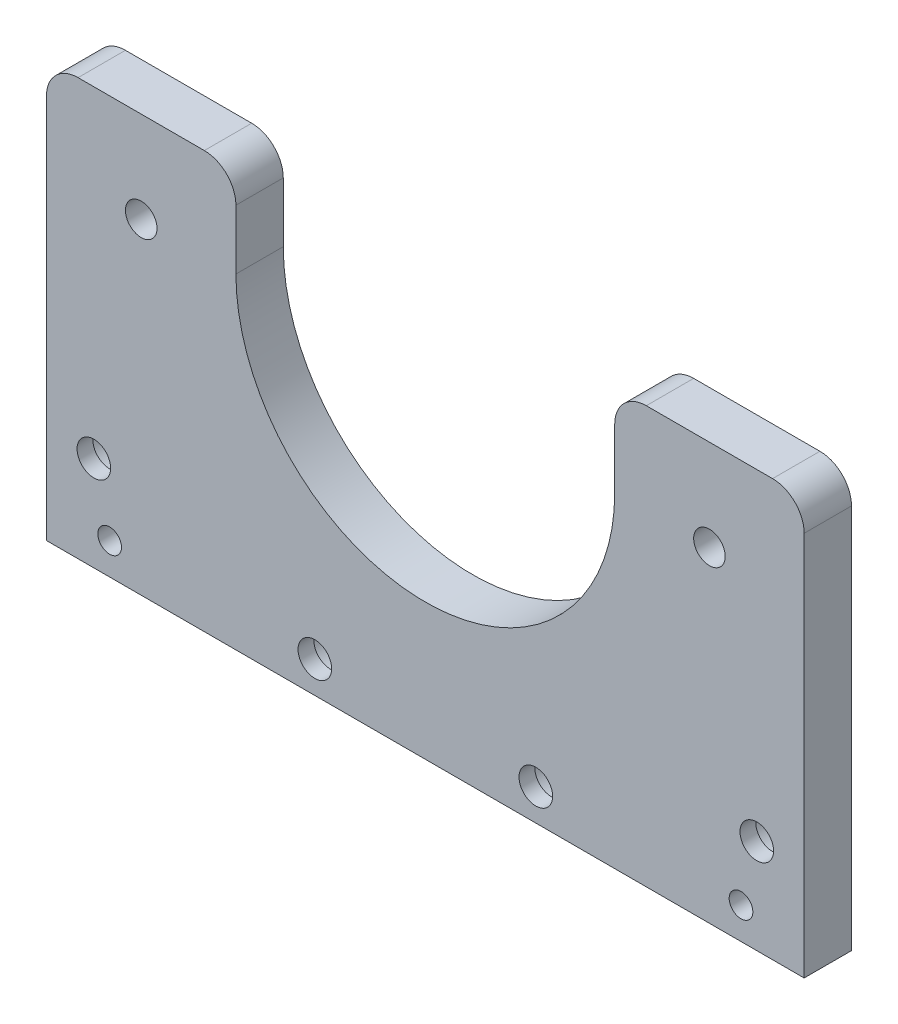
ISO-10303-21;
HEADER;
FILE_DESCRIPTION(('STEP AP214'),'2;1');
FILE_NAME('part.step','',(''),(''),'','','');
FILE_SCHEMA(('AUTOMOTIVE_DESIGN { 1 0 10303 214 1 1 1 1 }'));
ENDSEC;
DATA;
#1=APPLICATION_CONTEXT('core data for automotive mechanical design processes');
#2=APPLICATION_PROTOCOL_DEFINITION('international standard','automotive_design',2000,#1);
#3=PRODUCT_CONTEXT('',#1,'mechanical');
#4=PRODUCT('Part','Part','',(#3));
#5=PRODUCT_RELATED_PRODUCT_CATEGORY('part','',(#4));
#6=PRODUCT_DEFINITION_FORMATION('','',#4);
#7=PRODUCT_DEFINITION_CONTEXT('part definition',#1,'design');
#8=PRODUCT_DEFINITION('design','',#6,#7);
#9=PRODUCT_DEFINITION_SHAPE('','',#8);
#10=(LENGTH_UNIT() NAMED_UNIT(*) SI_UNIT(.MILLI.,.METRE.));
#11=(NAMED_UNIT(*) PLANE_ANGLE_UNIT() SI_UNIT($,.RADIAN.));
#12=(NAMED_UNIT(*) SI_UNIT($,.STERADIAN.) SOLID_ANGLE_UNIT());
#13=UNCERTAINTY_MEASURE_WITH_UNIT(LENGTH_MEASURE(1.E-05),#10,'distance_accuracy_value','');
#14=(GEOMETRIC_REPRESENTATION_CONTEXT(3) GLOBAL_UNCERTAINTY_ASSIGNED_CONTEXT((#13)) GLOBAL_UNIT_ASSIGNED_CONTEXT((#10,
#11,#12)) REPRESENTATION_CONTEXT('',''));
#15=CARTESIAN_POINT('',(0.,0.,0.));
#16=DIRECTION('',(0.,0.,1.));
#17=DIRECTION('',(1.,0.,0.));
#18=AXIS2_PLACEMENT_3D('',#15,#16,#17);
#19=CARTESIAN_POINT('',(-69.85,11.98626,4.7625));
#20=DIRECTION('',(0.,0.,-1.));
#21=DIRECTION('',(-1.,0.,0.));
#22=AXIS2_PLACEMENT_3D('',#19,#20,#21);
#23=PLANE('',#22);
#24=CARTESIAN_POINT('',(-66.675,-46.43374,4.7625));
#25=DIRECTION('',(0.,0.,-1.));
#26=DIRECTION('',(-1.,0.,0.));
#27=AXIS2_PLACEMENT_3D('',#24,#25,#26);
#28=CIRCLE('',#27,3.3782);
#29=CARTESIAN_POINT('',(-70.0532,-46.43374,4.7625));
#30=VERTEX_POINT('',#29);
#31=EDGE_CURVE('E392',#30,#30,#28,.T.);
#32=ORIENTED_EDGE('',*,*,#31,.T.);
#33=EDGE_LOOP('',(#32));
#34=FACE_BOUND('',#33,.T.);
#35=CARTESIAN_POINT('',(-22.225,-59.13374,4.7625));
#36=DIRECTION('',(0.,0.,-1.));
#37=DIRECTION('',(-1.,0.,0.));
#38=AXIS2_PLACEMENT_3D('',#35,#36,#37);
#39=CIRCLE('',#38,3.3782);
#40=CARTESIAN_POINT('',(-25.6032,-59.13374,4.7625));
#41=VERTEX_POINT('',#40);
#42=EDGE_CURVE('E408',#41,#41,#39,.T.);
#43=ORIENTED_EDGE('',*,*,#42,.T.);
#44=EDGE_LOOP('',(#43));
#45=FACE_BOUND('',#44,.T.);
#46=CARTESIAN_POINT('',(66.675,-46.43374,4.7625));
#47=DIRECTION('',(0.,0.,-1.));
#48=DIRECTION('',(-1.,0.,0.));
#49=AXIS2_PLACEMENT_3D('',#46,#47,#48);
#50=CIRCLE('',#49,3.3782);
#51=CARTESIAN_POINT('',(63.2968,-46.43374,4.7625));
#52=VERTEX_POINT('',#51);
#53=EDGE_CURVE('E424',#52,#52,#50,.T.);
#54=ORIENTED_EDGE('',*,*,#53,.T.);
#55=EDGE_LOOP('',(#54));
#56=FACE_BOUND('',#55,.T.);
#57=CARTESIAN_POINT('',(22.225,-59.13374,4.7625));
#58=DIRECTION('',(0.,0.,-1.));
#59=DIRECTION('',(-1.,0.,0.));
#60=AXIS2_PLACEMENT_3D('',#57,#58,#59);
#61=CIRCLE('',#60,3.3782);
#62=CARTESIAN_POINT('',(18.8468,-59.13374,4.7625));
#63=VERTEX_POINT('',#62);
#64=EDGE_CURVE('E440',#63,#63,#61,.T.);
#65=ORIENTED_EDGE('',*,*,#64,.T.);
#66=EDGE_LOOP('',(#65));
#67=FACE_BOUND('',#66,.T.);
#68=CARTESIAN_POINT('',(-69.85,11.98626,4.7625));
#69=DIRECTION('',(0.,0.,1.));
#70=DIRECTION('',(-1.,0.,0.));
#71=AXIS2_PLACEMENT_3D('',#68,#69,#70);
#72=CIRCLE('',#71,6.34999999999999);
#73=CARTESIAN_POINT('',(-69.85,18.33626,4.7625));
#74=VERTEX_POINT('',#73);
#75=CARTESIAN_POINT('',(-76.2,11.98626,4.7625));
#76=VERTEX_POINT('',#75);
#77=EDGE_CURVE('E200',#74,#76,#72,.T.);
#78=ORIENTED_EDGE('',*,*,#77,.T.);
#79=DIRECTION('',(0.,-1.,0.));
#80=VECTOR('',#79,1.);
#81=CARTESIAN_POINT('',(-76.2,11.98626,4.7625));
#82=LINE('',#81,#80);
#83=CARTESIAN_POINT('',(-76.2,-65.48374,4.7625));
#84=VERTEX_POINT('',#83);
#85=EDGE_CURVE('E112',#76,#84,#82,.T.);
#86=ORIENTED_EDGE('',*,*,#85,.T.);
#87=DIRECTION('',(1.,0.,0.));
#88=VECTOR('',#87,1.);
#89=CARTESIAN_POINT('',(76.2,-65.48374,4.7625));
#90=LINE('',#89,#88);
#91=CARTESIAN_POINT('',(76.2,-65.48374,4.7625));
#92=VERTEX_POINT('',#91);
#93=EDGE_CURVE('E237',#84,#92,#90,.T.);
#94=ORIENTED_EDGE('',*,*,#93,.T.);
#95=DIRECTION('',(0.,1.,0.));
#96=VECTOR('',#95,1.);
#97=CARTESIAN_POINT('',(76.2,11.98626,4.7625));
#98=LINE('',#97,#96);
#99=CARTESIAN_POINT('',(76.2,11.98626,4.7625));
#100=VERTEX_POINT('',#99);
#101=EDGE_CURVE('E257',#92,#100,#98,.T.);
#102=ORIENTED_EDGE('',*,*,#101,.T.);
#103=CARTESIAN_POINT('',(69.85,11.98626,4.7625));
#104=DIRECTION('',(0.,0.,1.));
#105=DIRECTION('',(1.,0.,0.));
#106=AXIS2_PLACEMENT_3D('',#103,#104,#105);
#107=CIRCLE('',#106,6.34999999999999);
#108=CARTESIAN_POINT('',(69.85,18.33626,4.7625));
#109=VERTEX_POINT('',#108);
#110=EDGE_CURVE('E253',#100,#109,#107,.T.);
#111=ORIENTED_EDGE('',*,*,#110,.T.);
#112=DIRECTION('',(-1.,0.,0.));
#113=VECTOR('',#112,1.);
#114=CARTESIAN_POINT('',(69.85,18.33626,4.7625));
#115=LINE('',#114,#113);
#116=CARTESIAN_POINT('',(44.45,18.33626,4.7625));
#117=VERTEX_POINT('',#116);
#118=EDGE_CURVE('E256',#109,#117,#115,.T.);
#119=ORIENTED_EDGE('',*,*,#118,.T.);
#120=CARTESIAN_POINT('',(44.45,11.98626,4.7625));
#121=DIRECTION('',(0.,0.,1.));
#122=DIRECTION('',(1.,0.,0.));
#123=AXIS2_PLACEMENT_3D('',#120,#121,#122);
#124=CIRCLE('',#123,6.34999999999999);
#125=CARTESIAN_POINT('',(38.1,11.98626,4.7625));
#126=VERTEX_POINT('',#125);
#127=EDGE_CURVE('E261',#117,#126,#124,.T.);
#128=ORIENTED_EDGE('',*,*,#127,.T.);
#129=DIRECTION('',(0.,-1.,0.));
#130=VECTOR('',#129,1.);
#131=CARTESIAN_POINT('',(38.1,0.,4.7625));
#132=LINE('',#131,#130);
#133=CARTESIAN_POINT('',(38.1,0.,4.7625));
#134=VERTEX_POINT('',#133);
#135=EDGE_CURVE('E268',#126,#134,#132,.T.);
#136=ORIENTED_EDGE('',*,*,#135,.T.);
#137=CARTESIAN_POINT('',(0.,0.,4.7625));
#138=DIRECTION('',(0.,0.,-1.));
#139=DIRECTION('',(1.,0.,0.));
#140=AXIS2_PLACEMENT_3D('',#137,#138,#139);
#141=CIRCLE('',#140,38.1);
#142=CARTESIAN_POINT('',(-38.1,0.,4.7625));
#143=VERTEX_POINT('',#142);
#144=EDGE_CURVE('E143',#134,#143,#141,.T.);
#145=ORIENTED_EDGE('',*,*,#144,.T.);
#146=DIRECTION('',(0.,1.,0.));
#147=VECTOR('',#146,1.);
#148=CARTESIAN_POINT('',(-38.1,0.,4.7625));
#149=LINE('',#148,#147);
#150=CARTESIAN_POINT('',(-38.1,11.98626,4.7625));
#151=VERTEX_POINT('',#150);
#152=EDGE_CURVE('E137',#143,#151,#149,.T.);
#153=ORIENTED_EDGE('',*,*,#152,.T.);
#154=CARTESIAN_POINT('',(-44.45,11.98626,4.7625));
#155=DIRECTION('',(0.,0.,1.));
#156=DIRECTION('',(-1.,0.,0.));
#157=AXIS2_PLACEMENT_3D('',#154,#155,#156);
#158=CIRCLE('',#157,6.34999999999999);
#159=CARTESIAN_POINT('',(-44.45,18.33626,4.7625));
#160=VERTEX_POINT('',#159);
#161=EDGE_CURVE('E141',#151,#160,#158,.T.);
#162=ORIENTED_EDGE('',*,*,#161,.T.);
#163=DIRECTION('',(-1.,0.,0.));
#164=VECTOR('',#163,1.);
#165=CARTESIAN_POINT('',(-69.85,18.33626,4.7625));
#166=LINE('',#165,#164);
#167=EDGE_CURVE('E57',#160,#74,#166,.T.);
#168=ORIENTED_EDGE('',*,*,#167,.T.);
#169=EDGE_LOOP('',(#78,#86,#94,#102,#111,#119,#128,#136,#145,#153,#162,#168));
#170=FACE_BOUND('',#169,.T.);
#171=CARTESIAN_POINT('',(-57.15,0.,4.7625));
#172=DIRECTION('',(0.,0.,1.));
#173=DIRECTION('',(1.,0.,0.));
#174=AXIS2_PLACEMENT_3D('',#171,#172,#173);
#175=CIRCLE('',#174,3.175);
#176=CARTESIAN_POINT('',(-60.325,0.,4.7625));
#177=VERTEX_POINT('',#176);
#178=EDGE_CURVE('E170',#177,#177,#175,.T.);
#179=ORIENTED_EDGE('',*,*,#178,.F.);
#180=EDGE_LOOP('',(#179));
#181=FACE_BOUND('',#180,.T.);
#182=CARTESIAN_POINT('',(57.15,0.,4.7625));
#183=DIRECTION('',(0.,0.,1.));
#184=DIRECTION('',(1.,0.,0.));
#185=AXIS2_PLACEMENT_3D('',#182,#183,#184);
#186=CIRCLE('',#185,3.175);
#187=CARTESIAN_POINT('',(53.975,0.,4.7625));
#188=VERTEX_POINT('',#187);
#189=EDGE_CURVE('E457',#188,#188,#186,.T.);
#190=ORIENTED_EDGE('',*,*,#189,.F.);
#191=EDGE_LOOP('',(#190));
#192=FACE_BOUND('',#191,.T.);
#193=CARTESIAN_POINT('',(-63.5,-59.13374,4.7625));
#194=DIRECTION('',(0.,0.,-1.));
#195=DIRECTION('',(-1.,0.,0.));
#196=AXIS2_PLACEMENT_3D('',#193,#194,#195);
#197=CIRCLE('',#196,2.38125);
#198=CARTESIAN_POINT('',(-65.88125,-59.13374,4.7625));
#199=VERTEX_POINT('',#198);
#200=EDGE_CURVE('E379',#199,#199,#197,.T.);
#201=ORIENTED_EDGE('',*,*,#200,.T.);
#202=EDGE_LOOP('',(#201));
#203=FACE_BOUND('',#202,.T.);
#204=CARTESIAN_POINT('',(63.5,-59.13374,4.7625));
#205=DIRECTION('',(0.,0.,-1.));
#206=DIRECTION('',(-1.,0.,0.));
#207=AXIS2_PLACEMENT_3D('',#204,#205,#206);
#208=CIRCLE('',#207,2.38125);
#209=CARTESIAN_POINT('',(61.11875,-59.13374,4.7625));
#210=VERTEX_POINT('',#209);
#211=EDGE_CURVE('E380',#210,#210,#208,.T.);
#212=ORIENTED_EDGE('',*,*,#211,.T.);
#213=EDGE_LOOP('',(#212));
#214=FACE_BOUND('',#213,.T.);
#215=ADVANCED_FACE('F39',(#34,#45,#56,#67,#170,#181,#192,#203,#214),#23,.F.);
#216=CARTESIAN_POINT('',(-69.85,11.98626,-4.7625));
#217=DIRECTION('',(0.,0.,-1.));
#218=DIRECTION('',(-1.,0.,0.));
#219=AXIS2_PLACEMENT_3D('',#216,#217,#218);
#220=PLANE('',#219);
#221=CARTESIAN_POINT('',(-66.675,-46.43374,-4.7625));
#222=DIRECTION('',(0.,0.,-1.));
#223=DIRECTION('',(-1.,0.,0.));
#224=AXIS2_PLACEMENT_3D('',#221,#222,#223);
#225=CIRCLE('',#224,5.55625);
#226=CARTESIAN_POINT('',(-72.23125,-46.43374,-4.7625));
#227=VERTEX_POINT('',#226);
#228=EDGE_CURVE('E404',#227,#227,#225,.T.);
#229=ORIENTED_EDGE('',*,*,#228,.F.);
#230=EDGE_LOOP('',(#229));
#231=FACE_BOUND('',#230,.T.);
#232=CARTESIAN_POINT('',(-22.225,-59.13374,-4.7625));
#233=DIRECTION('',(0.,0.,-1.));
#234=DIRECTION('',(-1.,0.,0.));
#235=AXIS2_PLACEMENT_3D('',#232,#233,#234);
#236=CIRCLE('',#235,5.55625);
#237=CARTESIAN_POINT('',(-27.78125,-59.13374,-4.7625));
#238=VERTEX_POINT('',#237);
#239=EDGE_CURVE('E420',#238,#238,#236,.T.);
#240=ORIENTED_EDGE('',*,*,#239,.F.);
#241=EDGE_LOOP('',(#240));
#242=FACE_BOUND('',#241,.T.);
#243=CARTESIAN_POINT('',(66.675,-46.43374,-4.7625));
#244=DIRECTION('',(0.,0.,-1.));
#245=DIRECTION('',(-1.,0.,0.));
#246=AXIS2_PLACEMENT_3D('',#243,#244,#245);
#247=CIRCLE('',#246,5.55625);
#248=CARTESIAN_POINT('',(61.11875,-46.43374,-4.7625));
#249=VERTEX_POINT('',#248);
#250=EDGE_CURVE('E436',#249,#249,#247,.T.);
#251=ORIENTED_EDGE('',*,*,#250,.F.);
#252=EDGE_LOOP('',(#251));
#253=FACE_BOUND('',#252,.T.);
#254=CARTESIAN_POINT('',(22.225,-59.13374,-4.7625));
#255=DIRECTION('',(0.,0.,-1.));
#256=DIRECTION('',(-1.,0.,0.));
#257=AXIS2_PLACEMENT_3D('',#254,#255,#256);
#258=CIRCLE('',#257,5.55625);
#259=CARTESIAN_POINT('',(16.66875,-59.13374,-4.7625));
#260=VERTEX_POINT('',#259);
#261=EDGE_CURVE('E452',#260,#260,#258,.T.);
#262=ORIENTED_EDGE('',*,*,#261,.F.);
#263=EDGE_LOOP('',(#262));
#264=FACE_BOUND('',#263,.T.);
#265=CARTESIAN_POINT('',(-57.15,0.,-4.7625));
#266=DIRECTION('',(0.,0.,1.));
#267=DIRECTION('',(1.,0.,0.));
#268=AXIS2_PLACEMENT_3D('',#265,#266,#267);
#269=CIRCLE('',#268,3.175);
#270=CARTESIAN_POINT('',(-60.325,0.,-4.7625));
#271=VERTEX_POINT('',#270);
#272=EDGE_CURVE('E461',#271,#271,#269,.T.);
#273=ORIENTED_EDGE('',*,*,#272,.T.);
#274=EDGE_LOOP('',(#273));
#275=FACE_BOUND('',#274,.T.);
#276=CARTESIAN_POINT('',(-69.85,11.98626,-4.7625));
#277=DIRECTION('',(0.,0.,1.));
#278=DIRECTION('',(-1.,0.,0.));
#279=AXIS2_PLACEMENT_3D('',#276,#277,#278);
#280=CIRCLE('',#279,6.34999999999999);
#281=CARTESIAN_POINT('',(-69.85,18.33626,-4.7625));
#282=VERTEX_POINT('',#281);
#283=CARTESIAN_POINT('',(-76.2,11.98626,-4.7625));
#284=VERTEX_POINT('',#283);
#285=EDGE_CURVE('E165',#282,#284,#280,.T.);
#286=ORIENTED_EDGE('',*,*,#285,.F.);
#287=DIRECTION('',(-1.,0.,0.));
#288=VECTOR('',#287,1.);
#289=CARTESIAN_POINT('',(-69.85,18.33626,-4.7625));
#290=LINE('',#289,#288);
#291=CARTESIAN_POINT('',(-44.45,18.33626,-4.7625));
#292=VERTEX_POINT('',#291);
#293=EDGE_CURVE('E104',#292,#282,#290,.T.);
#294=ORIENTED_EDGE('',*,*,#293,.F.);
#295=CARTESIAN_POINT('',(-44.45,11.98626,-4.7625));
#296=DIRECTION('',(0.,0.,1.));
#297=DIRECTION('',(-1.,0.,0.));
#298=AXIS2_PLACEMENT_3D('',#295,#296,#297);
#299=CIRCLE('',#298,6.34999999999999);
#300=CARTESIAN_POINT('',(-38.1,11.98626,-4.7625));
#301=VERTEX_POINT('',#300);
#302=EDGE_CURVE('E98',#301,#292,#299,.T.);
#303=ORIENTED_EDGE('',*,*,#302,.F.);
#304=DIRECTION('',(0.,1.,0.));
#305=VECTOR('',#304,1.);
#306=CARTESIAN_POINT('',(-38.1,0.,-4.7625));
#307=LINE('',#306,#305);
#308=CARTESIAN_POINT('',(-38.1,0.,-4.7625));
#309=VERTEX_POINT('',#308);
#310=EDGE_CURVE('E152',#309,#301,#307,.T.);
#311=ORIENTED_EDGE('',*,*,#310,.F.);
#312=CARTESIAN_POINT('',(0.,0.,-4.7625));
#313=DIRECTION('',(0.,0.,-1.));
#314=DIRECTION('',(1.,0.,0.));
#315=AXIS2_PLACEMENT_3D('',#312,#313,#314);
#316=CIRCLE('',#315,38.1);
#317=CARTESIAN_POINT('',(38.1,0.,-4.7625));
#318=VERTEX_POINT('',#317);
#319=EDGE_CURVE('E191',#318,#309,#316,.T.);
#320=ORIENTED_EDGE('',*,*,#319,.F.);
#321=DIRECTION('',(0.,-1.,0.));
#322=VECTOR('',#321,1.);
#323=CARTESIAN_POINT('',(38.1,0.,-4.7625));
#324=LINE('',#323,#322);
#325=CARTESIAN_POINT('',(38.1,11.98626,-4.7625));
#326=VERTEX_POINT('',#325);
#327=EDGE_CURVE('E188',#326,#318,#324,.T.);
#328=ORIENTED_EDGE('',*,*,#327,.F.);
#329=CARTESIAN_POINT('',(44.45,11.98626,-4.7625));
#330=DIRECTION('',(0.,0.,1.));
#331=DIRECTION('',(1.,0.,0.));
#332=AXIS2_PLACEMENT_3D('',#329,#330,#331);
#333=CIRCLE('',#332,6.34999999999999);
#334=CARTESIAN_POINT('',(44.45,18.33626,-4.7625));
#335=VERTEX_POINT('',#334);
#336=EDGE_CURVE('E185',#335,#326,#333,.T.);
#337=ORIENTED_EDGE('',*,*,#336,.F.);
#338=DIRECTION('',(-1.,0.,0.));
#339=VECTOR('',#338,1.);
#340=CARTESIAN_POINT('',(69.85,18.33626,-4.7625));
#341=LINE('',#340,#339);
#342=CARTESIAN_POINT('',(69.85,18.33626,-4.7625));
#343=VERTEX_POINT('',#342);
#344=EDGE_CURVE('E182',#343,#335,#341,.T.);
#345=ORIENTED_EDGE('',*,*,#344,.F.);
#346=CARTESIAN_POINT('',(69.85,11.98626,-4.7625));
#347=DIRECTION('',(0.,0.,1.));
#348=DIRECTION('',(1.,0.,0.));
#349=AXIS2_PLACEMENT_3D('',#346,#347,#348);
#350=CIRCLE('',#349,6.34999999999999);
#351=CARTESIAN_POINT('',(76.2,11.98626,-4.7625));
#352=VERTEX_POINT('',#351);
#353=EDGE_CURVE('E179',#352,#343,#350,.T.);
#354=ORIENTED_EDGE('',*,*,#353,.F.);
#355=DIRECTION('',(0.,1.,0.));
#356=VECTOR('',#355,1.);
#357=CARTESIAN_POINT('',(76.2,11.98626,-4.7625));
#358=LINE('',#357,#356);
#359=CARTESIAN_POINT('',(76.2,-65.48374,-4.7625));
#360=VERTEX_POINT('',#359);
#361=EDGE_CURVE('E176',#360,#352,#358,.T.);
#362=ORIENTED_EDGE('',*,*,#361,.F.);
#363=DIRECTION('',(1.,0.,0.));
#364=VECTOR('',#363,1.);
#365=CARTESIAN_POINT('',(76.2,-65.48374,-4.7625));
#366=LINE('',#365,#364);
#367=CARTESIAN_POINT('',(-76.2,-65.48374,-4.7625));
#368=VERTEX_POINT('',#367);
#369=EDGE_CURVE('E173',#368,#360,#366,.T.);
#370=ORIENTED_EDGE('',*,*,#369,.F.);
#371=DIRECTION('',(0.,-1.,0.));
#372=VECTOR('',#371,1.);
#373=CARTESIAN_POINT('',(-76.2,11.98626,-4.7625));
#374=LINE('',#373,#372);
#375=EDGE_CURVE('E169',#284,#368,#374,.T.);
#376=ORIENTED_EDGE('',*,*,#375,.F.);
#377=EDGE_LOOP('',(#286,#294,#303,#311,#320,#328,#337,#345,#354,#362,#370,#376));
#378=FACE_BOUND('',#377,.T.);
#379=CARTESIAN_POINT('',(57.15,0.,-4.7625));
#380=DIRECTION('',(0.,0.,1.));
#381=DIRECTION('',(1.,0.,0.));
#382=AXIS2_PLACEMENT_3D('',#379,#380,#381);
#383=CIRCLE('',#382,3.175);
#384=CARTESIAN_POINT('',(53.975,0.,-4.7625));
#385=VERTEX_POINT('',#384);
#386=EDGE_CURVE('E456',#385,#385,#383,.T.);
#387=ORIENTED_EDGE('',*,*,#386,.T.);
#388=EDGE_LOOP('',(#387));
#389=FACE_BOUND('',#388,.T.);
#390=ADVANCED_FACE('F241',(#231,#242,#253,#264,#275,#378,#389),#220,.T.);
#391=CARTESIAN_POINT('',(-69.85,11.98626,4.7625));
#392=DIRECTION('',(0.,0.,-1.));
#393=DIRECTION('',(-1.,0.,0.));
#394=AXIS2_PLACEMENT_3D('',#391,#392,#393);
#395=CYLINDRICAL_SURFACE('',#394,6.34999999999999);
#396=ORIENTED_EDGE('',*,*,#285,.T.);
#397=DIRECTION('',(0.,0.,-1.));
#398=VECTOR('',#397,1.);
#399=CARTESIAN_POINT('',(-76.2,11.98626,4.7625));
#400=LINE('',#399,#398);
#401=EDGE_CURVE('E11',#76,#284,#400,.T.);
#402=ORIENTED_EDGE('',*,*,#401,.F.);
#403=ORIENTED_EDGE('',*,*,#77,.F.);
#404=DIRECTION('',(0.,0.,-1.));
#405=VECTOR('',#404,1.);
#406=CARTESIAN_POINT('',(-69.85,18.33626,4.7625));
#407=LINE('',#406,#405);
#408=EDGE_CURVE('E161',#74,#282,#407,.T.);
#409=ORIENTED_EDGE('',*,*,#408,.T.);
#410=EDGE_LOOP('',(#396,#402,#403,#409));
#411=FACE_BOUND('',#410,.T.);
#412=ADVANCED_FACE('F41',(#411),#395,.T.);
#413=CARTESIAN_POINT('',(-76.2,11.98626,4.7625));
#414=DIRECTION('',(1.,0.,0.));
#415=DIRECTION('',(0.,1.,0.));
#416=AXIS2_PLACEMENT_3D('',#413,#414,#415);
#417=PLANE('',#416);
#418=ORIENTED_EDGE('',*,*,#375,.T.);
#419=DIRECTION('',(0.,0.,-1.));
#420=VECTOR('',#419,1.);
#421=CARTESIAN_POINT('',(-76.2,-65.48374,4.7625));
#422=LINE('',#421,#420);
#423=EDGE_CURVE('E49',#84,#368,#422,.T.);
#424=ORIENTED_EDGE('',*,*,#423,.F.);
#425=ORIENTED_EDGE('',*,*,#85,.F.);
#426=ORIENTED_EDGE('',*,*,#401,.T.);
#427=EDGE_LOOP('',(#418,#424,#425,#426));
#428=FACE_BOUND('',#427,.T.);
#429=ADVANCED_FACE('F671',(#428),#417,.F.);
#430=CARTESIAN_POINT('',(76.2,-65.48374,4.7625));
#431=DIRECTION('',(0.,1.,0.));
#432=DIRECTION('',(0.,0.,1.));
#433=AXIS2_PLACEMENT_3D('',#430,#431,#432);
#434=PLANE('',#433);
#435=ORIENTED_EDGE('',*,*,#369,.T.);
#436=DIRECTION('',(0.,0.,-1.));
#437=VECTOR('',#436,1.);
#438=CARTESIAN_POINT('',(76.2,-65.48374,4.7625));
#439=LINE('',#438,#437);
#440=EDGE_CURVE('E227',#92,#360,#439,.T.);
#441=ORIENTED_EDGE('',*,*,#440,.F.);
#442=ORIENTED_EDGE('',*,*,#93,.F.);
#443=ORIENTED_EDGE('',*,*,#423,.T.);
#444=EDGE_LOOP('',(#435,#441,#442,#443));
#445=FACE_BOUND('',#444,.T.);
#446=ADVANCED_FACE('F235',(#445),#434,.F.);
#447=CARTESIAN_POINT('',(76.2,11.98626,4.7625));
#448=DIRECTION('',(-1.,0.,0.));
#449=DIRECTION('',(0.,-1.,0.));
#450=AXIS2_PLACEMENT_3D('',#447,#448,#449);
#451=PLANE('',#450);
#452=ORIENTED_EDGE('',*,*,#361,.T.);
#453=DIRECTION('',(0.,0.,-1.));
#454=VECTOR('',#453,1.);
#455=CARTESIAN_POINT('',(76.2,11.98626,4.7625));
#456=LINE('',#455,#454);
#457=EDGE_CURVE('E223',#100,#352,#456,.T.);
#458=ORIENTED_EDGE('',*,*,#457,.F.);
#459=ORIENTED_EDGE('',*,*,#101,.F.);
#460=ORIENTED_EDGE('',*,*,#440,.T.);
#461=EDGE_LOOP('',(#452,#458,#459,#460));
#462=FACE_BOUND('',#461,.T.);
#463=ADVANCED_FACE('F247',(#462),#451,.F.);
#464=CARTESIAN_POINT('',(69.85,11.98626,4.7625));
#465=DIRECTION('',(0.,0.,-1.));
#466=DIRECTION('',(-1.,0.,0.));
#467=AXIS2_PLACEMENT_3D('',#464,#465,#466);
#468=CYLINDRICAL_SURFACE('',#467,6.34999999999999);
#469=ORIENTED_EDGE('',*,*,#353,.T.);
#470=DIRECTION('',(0.,0.,-1.));
#471=VECTOR('',#470,1.);
#472=CARTESIAN_POINT('',(69.85,18.33626,4.7625));
#473=LINE('',#472,#471);
#474=EDGE_CURVE('E219',#109,#343,#473,.T.);
#475=ORIENTED_EDGE('',*,*,#474,.F.);
#476=ORIENTED_EDGE('',*,*,#110,.F.);
#477=ORIENTED_EDGE('',*,*,#457,.T.);
#478=EDGE_LOOP('',(#469,#475,#476,#477));
#479=FACE_BOUND('',#478,.T.);
#480=ADVANCED_FACE('F251',(#479),#468,.T.);
#481=CARTESIAN_POINT('',(69.85,18.33626,4.7625));
#482=DIRECTION('',(0.,-1.,0.));
#483=DIRECTION('',(1.,0.,0.));
#484=AXIS2_PLACEMENT_3D('',#481,#482,#483);
#485=PLANE('',#484);
#486=ORIENTED_EDGE('',*,*,#344,.T.);
#487=DIRECTION('',(0.,0.,-1.));
#488=VECTOR('',#487,1.);
#489=CARTESIAN_POINT('',(44.45,18.33626,4.7625));
#490=LINE('',#489,#488);
#491=EDGE_CURVE('E215',#117,#335,#490,.T.);
#492=ORIENTED_EDGE('',*,*,#491,.F.);
#493=ORIENTED_EDGE('',*,*,#118,.F.);
#494=ORIENTED_EDGE('',*,*,#474,.T.);
#495=EDGE_LOOP('',(#486,#492,#493,#494));
#496=FACE_BOUND('',#495,.T.);
#497=ADVANCED_FACE('F636',(#496),#485,.F.);
#498=CARTESIAN_POINT('',(44.45,11.98626,4.7625));
#499=DIRECTION('',(0.,0.,-1.));
#500=DIRECTION('',(-1.,0.,0.));
#501=AXIS2_PLACEMENT_3D('',#498,#499,#500);
#502=CYLINDRICAL_SURFACE('',#501,6.34999999999999);
#503=ORIENTED_EDGE('',*,*,#336,.T.);
#504=DIRECTION('',(0.,0.,-1.));
#505=VECTOR('',#504,1.);
#506=CARTESIAN_POINT('',(38.1,11.98626,4.7625));
#507=LINE('',#506,#505);
#508=EDGE_CURVE('E211',#126,#326,#507,.T.);
#509=ORIENTED_EDGE('',*,*,#508,.F.);
#510=ORIENTED_EDGE('',*,*,#127,.F.);
#511=ORIENTED_EDGE('',*,*,#491,.T.);
#512=EDGE_LOOP('',(#503,#509,#510,#511));
#513=FACE_BOUND('',#512,.T.);
#514=ADVANCED_FACE('F627',(#513),#502,.T.);
#515=CARTESIAN_POINT('',(38.1,0.,4.7625));
#516=DIRECTION('',(1.,0.,0.));
#517=DIRECTION('',(0.,0.,-1.));
#518=AXIS2_PLACEMENT_3D('',#515,#516,#517);
#519=PLANE('',#518);
#520=ORIENTED_EDGE('',*,*,#327,.T.);
#521=DIRECTION('',(0.,0.,-1.));
#522=VECTOR('',#521,1.);
#523=CARTESIAN_POINT('',(38.1,0.,4.7625));
#524=LINE('',#523,#522);
#525=EDGE_CURVE('E207',#134,#318,#524,.T.);
#526=ORIENTED_EDGE('',*,*,#525,.F.);
#527=ORIENTED_EDGE('',*,*,#135,.F.);
#528=ORIENTED_EDGE('',*,*,#508,.T.);
#529=EDGE_LOOP('',(#520,#526,#527,#528));
#530=FACE_BOUND('',#529,.T.);
#531=ADVANCED_FACE('F276',(#530),#519,.F.);
#532=CARTESIAN_POINT('',(0.,0.,4.7625));
#533=DIRECTION('',(0.,0.,-1.));
#534=DIRECTION('',(-1.,0.,0.));
#535=AXIS2_PLACEMENT_3D('',#532,#533,#534);
#536=CYLINDRICAL_SURFACE('',#535,38.1);
#537=ORIENTED_EDGE('',*,*,#319,.T.);
#538=DIRECTION('',(0.,0.,-1.));
#539=VECTOR('',#538,1.);
#540=CARTESIAN_POINT('',(-38.1,0.,4.7625));
#541=LINE('',#540,#539);
#542=EDGE_CURVE('E154',#143,#309,#541,.T.);
#543=ORIENTED_EDGE('',*,*,#542,.F.);
#544=ORIENTED_EDGE('',*,*,#144,.F.);
#545=ORIENTED_EDGE('',*,*,#525,.T.);
#546=EDGE_LOOP('',(#537,#543,#544,#545));
#547=FACE_BOUND('',#546,.T.);
#548=ADVANCED_FACE('F280',(#547),#536,.F.);
#549=CARTESIAN_POINT('',(-38.1,0.,4.7625));
#550=DIRECTION('',(-1.,0.,0.));
#551=DIRECTION('',(0.,0.,1.));
#552=AXIS2_PLACEMENT_3D('',#549,#550,#551);
#553=PLANE('',#552);
#554=ORIENTED_EDGE('',*,*,#310,.T.);
#555=DIRECTION('',(0.,0.,-1.));
#556=VECTOR('',#555,1.);
#557=CARTESIAN_POINT('',(-38.1,11.98626,4.7625));
#558=LINE('',#557,#556);
#559=EDGE_CURVE('E149',#151,#301,#558,.T.);
#560=ORIENTED_EDGE('',*,*,#559,.F.);
#561=ORIENTED_EDGE('',*,*,#152,.F.);
#562=ORIENTED_EDGE('',*,*,#542,.T.);
#563=EDGE_LOOP('',(#554,#560,#561,#562));
#564=FACE_BOUND('',#563,.T.);
#565=ADVANCED_FACE('F150',(#564),#553,.F.);
#566=CARTESIAN_POINT('',(-44.45,11.98626,4.7625));
#567=DIRECTION('',(0.,0.,-1.));
#568=DIRECTION('',(-1.,0.,0.));
#569=AXIS2_PLACEMENT_3D('',#566,#567,#568);
#570=CYLINDRICAL_SURFACE('',#569,6.34999999999999);
#571=ORIENTED_EDGE('',*,*,#302,.T.);
#572=DIRECTION('',(0.,0.,-1.));
#573=VECTOR('',#572,1.);
#574=CARTESIAN_POINT('',(-44.45,18.33626,4.7625));
#575=LINE('',#574,#573);
#576=EDGE_CURVE('E155',#160,#292,#575,.T.);
#577=ORIENTED_EDGE('',*,*,#576,.F.);
#578=ORIENTED_EDGE('',*,*,#161,.F.);
#579=ORIENTED_EDGE('',*,*,#559,.T.);
#580=EDGE_LOOP('',(#571,#577,#578,#579));
#581=FACE_BOUND('',#580,.T.);
#582=ADVANCED_FACE('F157',(#581),#570,.T.);
#583=CARTESIAN_POINT('',(-69.85,18.33626,4.7625));
#584=DIRECTION('',(0.,-1.,0.));
#585=DIRECTION('',(1.,0.,0.));
#586=AXIS2_PLACEMENT_3D('',#583,#584,#585);
#587=PLANE('',#586);
#588=ORIENTED_EDGE('',*,*,#293,.T.);
#589=ORIENTED_EDGE('',*,*,#408,.F.);
#590=ORIENTED_EDGE('',*,*,#167,.F.);
#591=ORIENTED_EDGE('',*,*,#576,.T.);
#592=EDGE_LOOP('',(#588,#589,#590,#591));
#593=FACE_BOUND('',#592,.T.);
#594=ADVANCED_FACE('F284',(#593),#587,.F.);
#595=CARTESIAN_POINT('',(-57.15,0.,4.7625));
#596=DIRECTION('',(0.,0.,-1.));
#597=DIRECTION('',(-1.,0.,0.));
#598=AXIS2_PLACEMENT_3D('',#595,#596,#597);
#599=CYLINDRICAL_SURFACE('',#598,3.175);
#600=CARTESIAN_POINT('',(-60.325,0.,4.7625));
#601=CARTESIAN_POINT('',(-60.325,0.,4.66328125));
#602=CARTESIAN_POINT('',(-60.325,0.,4.5640625));
#603=CARTESIAN_POINT('',(-60.325,0.,4.365625));
#604=CARTESIAN_POINT('',(-60.325,0.,4.26640625));
#605=CARTESIAN_POINT('',(-60.325,0.,4.06796875));
#606=CARTESIAN_POINT('',(-60.325,0.,3.96875));
#607=CARTESIAN_POINT('',(-60.325,0.,3.7703125));
#608=CARTESIAN_POINT('',(-60.325,0.,3.67109375));
#609=CARTESIAN_POINT('',(-60.325,0.,3.47265625));
#610=CARTESIAN_POINT('',(-60.325,0.,3.3734375));
#611=CARTESIAN_POINT('',(-60.325,0.,3.175));
#612=CARTESIAN_POINT('',(-60.325,0.,3.07578125));
#613=CARTESIAN_POINT('',(-60.325,0.,2.87734375));
#614=CARTESIAN_POINT('',(-60.325,0.,2.778125));
#615=CARTESIAN_POINT('',(-60.325,0.,2.5796875));
#616=CARTESIAN_POINT('',(-60.325,0.,2.48046875));
#617=CARTESIAN_POINT('',(-60.325,0.,2.28203125));
#618=CARTESIAN_POINT('',(-60.325,0.,2.1828125));
#619=CARTESIAN_POINT('',(-60.325,0.,1.984375));
#620=CARTESIAN_POINT('',(-60.325,0.,1.88515625));
#621=CARTESIAN_POINT('',(-60.325,0.,1.68671875));
#622=CARTESIAN_POINT('',(-60.325,0.,1.5875));
#623=CARTESIAN_POINT('',(-60.325,0.,1.3890625));
#624=CARTESIAN_POINT('',(-60.325,0.,1.28984375));
#625=CARTESIAN_POINT('',(-60.325,0.,1.09140625));
#626=CARTESIAN_POINT('',(-60.325,0.,0.992187499999999));
#627=CARTESIAN_POINT('',(-60.325,0.,0.79375));
#628=CARTESIAN_POINT('',(-60.325,0.,0.69453125));
#629=CARTESIAN_POINT('',(-60.325,0.,0.49609375));
#630=CARTESIAN_POINT('',(-60.325,0.,0.396875));
#631=CARTESIAN_POINT('',(-60.325,0.,0.1984375));
#632=CARTESIAN_POINT('',(-60.325,0.,0.0992187500000001));
#633=CARTESIAN_POINT('',(-60.325,0.,-0.0992187500000001));
#634=CARTESIAN_POINT('',(-60.325,0.,-0.1984375));
#635=CARTESIAN_POINT('',(-60.325,0.,-0.396875));
#636=CARTESIAN_POINT('',(-60.325,0.,-0.49609375));
#637=CARTESIAN_POINT('',(-60.325,0.,-0.69453125));
#638=CARTESIAN_POINT('',(-60.325,0.,-0.793750000000001));
#639=CARTESIAN_POINT('',(-60.325,0.,-0.992187500000001));
#640=CARTESIAN_POINT('',(-60.325,0.,-1.09140625));
#641=CARTESIAN_POINT('',(-60.325,0.,-1.28984375));
#642=CARTESIAN_POINT('',(-60.325,0.,-1.3890625));
#643=CARTESIAN_POINT('',(-60.325,0.,-1.5875));
#644=CARTESIAN_POINT('',(-60.325,0.,-1.68671875));
#645=CARTESIAN_POINT('',(-60.325,0.,-1.88515625));
#646=CARTESIAN_POINT('',(-60.325,0.,-1.984375));
#647=CARTESIAN_POINT('',(-60.325,0.,-2.1828125));
#648=CARTESIAN_POINT('',(-60.325,0.,-2.28203125));
#649=CARTESIAN_POINT('',(-60.325,0.,-2.48046875));
#650=CARTESIAN_POINT('',(-60.325,0.,-2.5796875));
#651=CARTESIAN_POINT('',(-60.325,0.,-2.778125));
#652=CARTESIAN_POINT('',(-60.325,0.,-2.87734375));
#653=CARTESIAN_POINT('',(-60.325,0.,-3.07578125));
#654=CARTESIAN_POINT('',(-60.325,0.,-3.175));
#655=CARTESIAN_POINT('',(-60.325,0.,-3.3734375));
#656=CARTESIAN_POINT('',(-60.325,0.,-3.47265625));
#657=CARTESIAN_POINT('',(-60.325,0.,-3.67109375));
#658=CARTESIAN_POINT('',(-60.325,0.,-3.7703125));
#659=CARTESIAN_POINT('',(-60.325,0.,-3.96875));
#660=CARTESIAN_POINT('',(-60.325,0.,-4.06796875));
#661=CARTESIAN_POINT('',(-60.325,0.,-4.26640625));
#662=CARTESIAN_POINT('',(-60.325,0.,-4.365625));
#663=CARTESIAN_POINT('',(-60.325,0.,-4.5640625));
#664=CARTESIAN_POINT('',(-60.325,0.,-4.66328125));
#665=CARTESIAN_POINT('',(-60.325,0.,-4.7625));
#666=B_SPLINE_CURVE_WITH_KNOTS('',3,(#600,#601,#602,#603,#604,#605,#606,#607,#608,#609,#610,
#611,#612,#613,#614,#615,#616,#617,#618,#619,#620,#621,#622,#623,#624,#625,#626,#627,#628,#629,
#630,#631,#632,#633,#634,#635,#636,#637,#638,#639,#640,#641,#642,#643,#644,#645,#646,#647,#648,
#649,#650,#651,#652,#653,#654,#655,#656,#657,#658,#659,#660,#661,#662,#663,#664,#665),
.UNSPECIFIED.,.F.,.F.,(4,2,2,2,2,2,2,2,2,2,2,2,2,2,2,2,2,2,2,2,2,2,2,2,2,2,2,2,2,2,2,2,4),(0.,
0.29765625,0.5953125,0.892968750000001,1.190625,1.48828125,1.7859375,2.08359375,2.38125,
2.67890625,2.9765625,3.27421875,3.571875,3.86953125,4.1671875,4.46484375,4.7625,5.06015625,
5.3578125,5.65546875,5.953125,6.25078125,6.5484375,6.84609375,7.14375,7.44140625,7.7390625,
8.03671875,8.334375,8.63203125,8.9296875,9.22734375,9.525),.UNSPECIFIED.);
#667=EDGE_CURVE('BSEAM286',#177,#271,#666,.T.);
#668=ORIENTED_EDGE('',*,*,#178,.T.);
#669=ORIENTED_EDGE('',*,*,#272,.F.);
#670=ORIENTED_EDGE('',*,*,#667,.T.);
#671=ORIENTED_EDGE('',*,*,#667,.F.);
#672=EDGE_LOOP('',(#668,#670,#669,#671));
#673=FACE_BOUND('',#672,.T.);
#674=ADVANCED_FACE('F286',(#673),#599,.F.);
#675=CARTESIAN_POINT('',(57.15,0.,4.7625));
#676=DIRECTION('',(0.,0.,-1.));
#677=DIRECTION('',(-1.,0.,0.));
#678=AXIS2_PLACEMENT_3D('',#675,#676,#677);
#679=CYLINDRICAL_SURFACE('',#678,3.175);
#680=CARTESIAN_POINT('',(53.975,0.,4.7625));
#681=CARTESIAN_POINT('',(53.975,0.,4.66328125));
#682=CARTESIAN_POINT('',(53.975,0.,4.5640625));
#683=CARTESIAN_POINT('',(53.975,0.,4.365625));
#684=CARTESIAN_POINT('',(53.975,0.,4.26640625));
#685=CARTESIAN_POINT('',(53.975,0.,4.06796875));
#686=CARTESIAN_POINT('',(53.975,0.,3.96875));
#687=CARTESIAN_POINT('',(53.975,0.,3.7703125));
#688=CARTESIAN_POINT('',(53.975,0.,3.67109375));
#689=CARTESIAN_POINT('',(53.975,0.,3.47265625));
#690=CARTESIAN_POINT('',(53.975,0.,3.3734375));
#691=CARTESIAN_POINT('',(53.975,0.,3.175));
#692=CARTESIAN_POINT('',(53.975,0.,3.07578125));
#693=CARTESIAN_POINT('',(53.975,0.,2.87734375));
#694=CARTESIAN_POINT('',(53.975,0.,2.778125));
#695=CARTESIAN_POINT('',(53.975,0.,2.5796875));
#696=CARTESIAN_POINT('',(53.975,0.,2.48046875));
#697=CARTESIAN_POINT('',(53.975,0.,2.28203125));
#698=CARTESIAN_POINT('',(53.975,0.,2.1828125));
#699=CARTESIAN_POINT('',(53.975,0.,1.984375));
#700=CARTESIAN_POINT('',(53.975,0.,1.88515625));
#701=CARTESIAN_POINT('',(53.975,0.,1.68671875));
#702=CARTESIAN_POINT('',(53.975,0.,1.5875));
#703=CARTESIAN_POINT('',(53.975,0.,1.3890625));
#704=CARTESIAN_POINT('',(53.975,0.,1.28984375));
#705=CARTESIAN_POINT('',(53.975,0.,1.09140625));
#706=CARTESIAN_POINT('',(53.975,0.,0.992187499999999));
#707=CARTESIAN_POINT('',(53.975,0.,0.79375));
#708=CARTESIAN_POINT('',(53.975,0.,0.69453125));
#709=CARTESIAN_POINT('',(53.975,0.,0.49609375));
#710=CARTESIAN_POINT('',(53.975,0.,0.396875));
#711=CARTESIAN_POINT('',(53.975,0.,0.1984375));
#712=CARTESIAN_POINT('',(53.975,0.,0.0992187500000001));
#713=CARTESIAN_POINT('',(53.975,0.,-0.0992187500000001));
#714=CARTESIAN_POINT('',(53.975,0.,-0.1984375));
#715=CARTESIAN_POINT('',(53.975,0.,-0.396875));
#716=CARTESIAN_POINT('',(53.975,0.,-0.49609375));
#717=CARTESIAN_POINT('',(53.975,0.,-0.69453125));
#718=CARTESIAN_POINT('',(53.975,0.,-0.793750000000001));
#719=CARTESIAN_POINT('',(53.975,0.,-0.992187500000001));
#720=CARTESIAN_POINT('',(53.975,0.,-1.09140625));
#721=CARTESIAN_POINT('',(53.975,0.,-1.28984375));
#722=CARTESIAN_POINT('',(53.975,0.,-1.3890625));
#723=CARTESIAN_POINT('',(53.975,0.,-1.5875));
#724=CARTESIAN_POINT('',(53.975,0.,-1.68671875));
#725=CARTESIAN_POINT('',(53.975,0.,-1.88515625));
#726=CARTESIAN_POINT('',(53.975,0.,-1.984375));
#727=CARTESIAN_POINT('',(53.975,0.,-2.1828125));
#728=CARTESIAN_POINT('',(53.975,0.,-2.28203125));
#729=CARTESIAN_POINT('',(53.975,0.,-2.48046875));
#730=CARTESIAN_POINT('',(53.975,0.,-2.5796875));
#731=CARTESIAN_POINT('',(53.975,0.,-2.778125));
#732=CARTESIAN_POINT('',(53.975,0.,-2.87734375));
#733=CARTESIAN_POINT('',(53.975,0.,-3.07578125));
#734=CARTESIAN_POINT('',(53.975,0.,-3.175));
#735=CARTESIAN_POINT('',(53.975,0.,-3.3734375));
#736=CARTESIAN_POINT('',(53.975,0.,-3.47265625));
#737=CARTESIAN_POINT('',(53.975,0.,-3.67109375));
#738=CARTESIAN_POINT('',(53.975,0.,-3.7703125));
#739=CARTESIAN_POINT('',(53.975,0.,-3.96875));
#740=CARTESIAN_POINT('',(53.975,0.,-4.06796875));
#741=CARTESIAN_POINT('',(53.975,0.,-4.26640625));
#742=CARTESIAN_POINT('',(53.975,0.,-4.365625));
#743=CARTESIAN_POINT('',(53.975,0.,-4.5640625));
#744=CARTESIAN_POINT('',(53.975,0.,-4.66328125));
#745=CARTESIAN_POINT('',(53.975,0.,-4.7625));
#746=B_SPLINE_CURVE_WITH_KNOTS('',3,(#680,#681,#682,#683,#684,#685,#686,#687,#688,#689,#690,
#691,#692,#693,#694,#695,#696,#697,#698,#699,#700,#701,#702,#703,#704,#705,#706,#707,#708,#709,
#710,#711,#712,#713,#714,#715,#716,#717,#718,#719,#720,#721,#722,#723,#724,#725,#726,#727,#728,
#729,#730,#731,#732,#733,#734,#735,#736,#737,#738,#739,#740,#741,#742,#743,#744,#745),
.UNSPECIFIED.,.F.,.F.,(4,2,2,2,2,2,2,2,2,2,2,2,2,2,2,2,2,2,2,2,2,2,2,2,2,2,2,2,2,2,2,2,4),(0.,
0.29765625,0.5953125,0.892968750000001,1.190625,1.48828125,1.7859375,2.08359375,2.38125,
2.67890625,2.9765625,3.27421875,3.571875,3.86953125,4.1671875,4.46484375,4.7625,5.06015625,
5.3578125,5.65546875,5.953125,6.25078125,6.5484375,6.84609375,7.14375,7.44140625,7.7390625,
8.03671875,8.334375,8.63203125,8.9296875,9.22734375,9.525),.UNSPECIFIED.);
#747=EDGE_CURVE('BSEAM292',#188,#385,#746,.T.);
#748=ORIENTED_EDGE('',*,*,#189,.T.);
#749=ORIENTED_EDGE('',*,*,#386,.F.);
#750=ORIENTED_EDGE('',*,*,#747,.T.);
#751=ORIENTED_EDGE('',*,*,#747,.F.);
#752=EDGE_LOOP('',(#748,#750,#749,#751));
#753=FACE_BOUND('',#752,.T.);
#754=ADVANCED_FACE('F292',(#753),#679,.F.);
#755=CARTESIAN_POINT('',(22.225,-59.13374,-4.7625));
#756=DIRECTION('',(0.,0.,-1.));
#757=DIRECTION('',(-1.,0.,0.));
#758=AXIS2_PLACEMENT_3D('',#755,#756,#757);
#759=CYLINDRICAL_SURFACE('',#758,5.55625);
#760=CARTESIAN_POINT('',(22.225,-59.13374,1.5875));
#761=DIRECTION('',(0.,0.,-1.));
#762=DIRECTION('',(-1.,0.,0.));
#763=AXIS2_PLACEMENT_3D('',#760,#761,#762);
#764=CIRCLE('',#763,5.55625);
#765=CARTESIAN_POINT('',(16.66875,-59.13374,1.5875));
#766=VERTEX_POINT('',#765);
#767=EDGE_CURVE('E448',#766,#766,#764,.T.);
#768=ORIENTED_EDGE('',*,*,#767,.F.);
#769=EDGE_LOOP('',(#768));
#770=FACE_BOUND('',#769,.T.);
#771=ORIENTED_EDGE('',*,*,#261,.T.);
#772=EDGE_LOOP('',(#771));
#773=FACE_BOUND('',#772,.T.);
#774=ADVANCED_FACE('F309',(#770,#773),#759,.F.);
#775=CARTESIAN_POINT('',(25.6032,-59.13374,1.5875));
#776=DIRECTION('',(0.,0.,1.));
#777=DIRECTION('',(1.,0.,0.));
#778=AXIS2_PLACEMENT_3D('',#775,#776,#777);
#779=PLANE('',#778);
#780=CARTESIAN_POINT('',(22.225,-59.13374,1.5875));
#781=DIRECTION('',(0.,0.,-1.));
#782=DIRECTION('',(-1.,0.,0.));
#783=AXIS2_PLACEMENT_3D('',#780,#781,#782);
#784=CIRCLE('',#783,3.3782);
#785=CARTESIAN_POINT('',(18.8468,-59.13374,1.5875));
#786=VERTEX_POINT('',#785);
#787=EDGE_CURVE('E444',#786,#786,#784,.T.);
#788=ORIENTED_EDGE('',*,*,#787,.F.);
#789=EDGE_LOOP('',(#788));
#790=FACE_BOUND('',#789,.T.);
#791=ORIENTED_EDGE('',*,*,#767,.T.);
#792=EDGE_LOOP('',(#791));
#793=FACE_BOUND('',#792,.T.);
#794=ADVANCED_FACE('F313',(#790,#793),#779,.F.);
#795=CARTESIAN_POINT('',(22.225,-59.13374,-4.7625));
#796=DIRECTION('',(0.,0.,-1.));
#797=DIRECTION('',(-1.,0.,0.));
#798=AXIS2_PLACEMENT_3D('',#795,#796,#797);
#799=CYLINDRICAL_SURFACE('',#798,3.3782);
#800=ORIENTED_EDGE('',*,*,#64,.F.);
#801=EDGE_LOOP('',(#800));
#802=FACE_BOUND('',#801,.T.);
#803=ORIENTED_EDGE('',*,*,#787,.T.);
#804=EDGE_LOOP('',(#803));
#805=FACE_BOUND('',#804,.T.);
#806=ADVANCED_FACE('F317',(#802,#805),#799,.F.);
#807=CARTESIAN_POINT('',(66.675,-46.43374,-4.7625));
#808=DIRECTION('',(0.,0.,-1.));
#809=DIRECTION('',(-1.,0.,0.));
#810=AXIS2_PLACEMENT_3D('',#807,#808,#809);
#811=CYLINDRICAL_SURFACE('',#810,5.55625);
#812=CARTESIAN_POINT('',(66.675,-46.43374,1.5875));
#813=DIRECTION('',(0.,0.,-1.));
#814=DIRECTION('',(-1.,0.,0.));
#815=AXIS2_PLACEMENT_3D('',#812,#813,#814);
#816=CIRCLE('',#815,5.55625);
#817=CARTESIAN_POINT('',(61.11875,-46.43374,1.5875));
#818=VERTEX_POINT('',#817);
#819=EDGE_CURVE('E432',#818,#818,#816,.T.);
#820=ORIENTED_EDGE('',*,*,#819,.F.);
#821=EDGE_LOOP('',(#820));
#822=FACE_BOUND('',#821,.T.);
#823=ORIENTED_EDGE('',*,*,#250,.T.);
#824=EDGE_LOOP('',(#823));
#825=FACE_BOUND('',#824,.T.);
#826=ADVANCED_FACE('F321',(#822,#825),#811,.F.);
#827=CARTESIAN_POINT('',(70.0532,-46.43374,1.5875));
#828=DIRECTION('',(0.,0.,1.));
#829=DIRECTION('',(1.,0.,0.));
#830=AXIS2_PLACEMENT_3D('',#827,#828,#829);
#831=PLANE('',#830);
#832=CARTESIAN_POINT('',(66.675,-46.43374,1.5875));
#833=DIRECTION('',(0.,0.,-1.));
#834=DIRECTION('',(-1.,0.,0.));
#835=AXIS2_PLACEMENT_3D('',#832,#833,#834);
#836=CIRCLE('',#835,3.3782);
#837=CARTESIAN_POINT('',(63.2968,-46.43374,1.5875));
#838=VERTEX_POINT('',#837);
#839=EDGE_CURVE('E428',#838,#838,#836,.T.);
#840=ORIENTED_EDGE('',*,*,#839,.F.);
#841=EDGE_LOOP('',(#840));
#842=FACE_BOUND('',#841,.T.);
#843=ORIENTED_EDGE('',*,*,#819,.T.);
#844=EDGE_LOOP('',(#843));
#845=FACE_BOUND('',#844,.T.);
#846=ADVANCED_FACE('F325',(#842,#845),#831,.F.);
#847=CARTESIAN_POINT('',(66.675,-46.43374,-4.7625));
#848=DIRECTION('',(0.,0.,-1.));
#849=DIRECTION('',(-1.,0.,0.));
#850=AXIS2_PLACEMENT_3D('',#847,#848,#849);
#851=CYLINDRICAL_SURFACE('',#850,3.3782);
#852=ORIENTED_EDGE('',*,*,#53,.F.);
#853=EDGE_LOOP('',(#852));
#854=FACE_BOUND('',#853,.T.);
#855=ORIENTED_EDGE('',*,*,#839,.T.);
#856=EDGE_LOOP('',(#855));
#857=FACE_BOUND('',#856,.T.);
#858=ADVANCED_FACE('F329',(#854,#857),#851,.F.);
#859=CARTESIAN_POINT('',(-22.225,-59.13374,-4.7625));
#860=DIRECTION('',(0.,0.,-1.));
#861=DIRECTION('',(-1.,0.,0.));
#862=AXIS2_PLACEMENT_3D('',#859,#860,#861);
#863=CYLINDRICAL_SURFACE('',#862,5.55625);
#864=CARTESIAN_POINT('',(-22.225,-59.13374,1.5875));
#865=DIRECTION('',(0.,0.,-1.));
#866=DIRECTION('',(-1.,0.,0.));
#867=AXIS2_PLACEMENT_3D('',#864,#865,#866);
#868=CIRCLE('',#867,5.55625);
#869=CARTESIAN_POINT('',(-27.78125,-59.13374,1.5875));
#870=VERTEX_POINT('',#869);
#871=EDGE_CURVE('E416',#870,#870,#868,.T.);
#872=ORIENTED_EDGE('',*,*,#871,.F.);
#873=EDGE_LOOP('',(#872));
#874=FACE_BOUND('',#873,.T.);
#875=ORIENTED_EDGE('',*,*,#239,.T.);
#876=EDGE_LOOP('',(#875));
#877=FACE_BOUND('',#876,.T.);
#878=ADVANCED_FACE('F333',(#874,#877),#863,.F.);
#879=CARTESIAN_POINT('',(-18.8468,-59.13374,1.5875));
#880=DIRECTION('',(0.,0.,1.));
#881=DIRECTION('',(1.,0.,0.));
#882=AXIS2_PLACEMENT_3D('',#879,#880,#881);
#883=PLANE('',#882);
#884=CARTESIAN_POINT('',(-22.225,-59.13374,1.5875));
#885=DIRECTION('',(0.,0.,-1.));
#886=DIRECTION('',(-1.,0.,0.));
#887=AXIS2_PLACEMENT_3D('',#884,#885,#886);
#888=CIRCLE('',#887,3.3782);
#889=CARTESIAN_POINT('',(-25.6032,-59.13374,1.5875));
#890=VERTEX_POINT('',#889);
#891=EDGE_CURVE('E412',#890,#890,#888,.T.);
#892=ORIENTED_EDGE('',*,*,#891,.F.);
#893=EDGE_LOOP('',(#892));
#894=FACE_BOUND('',#893,.T.);
#895=ORIENTED_EDGE('',*,*,#871,.T.);
#896=EDGE_LOOP('',(#895));
#897=FACE_BOUND('',#896,.T.);
#898=ADVANCED_FACE('F337',(#894,#897),#883,.F.);
#899=CARTESIAN_POINT('',(-22.225,-59.13374,-4.7625));
#900=DIRECTION('',(0.,0.,-1.));
#901=DIRECTION('',(-1.,0.,0.));
#902=AXIS2_PLACEMENT_3D('',#899,#900,#901);
#903=CYLINDRICAL_SURFACE('',#902,3.3782);
#904=ORIENTED_EDGE('',*,*,#42,.F.);
#905=EDGE_LOOP('',(#904));
#906=FACE_BOUND('',#905,.T.);
#907=ORIENTED_EDGE('',*,*,#891,.T.);
#908=EDGE_LOOP('',(#907));
#909=FACE_BOUND('',#908,.T.);
#910=ADVANCED_FACE('F341',(#906,#909),#903,.F.);
#911=CARTESIAN_POINT('',(-66.675,-46.43374,-4.7625));
#912=DIRECTION('',(0.,0.,-1.));
#913=DIRECTION('',(-1.,0.,0.));
#914=AXIS2_PLACEMENT_3D('',#911,#912,#913);
#915=CYLINDRICAL_SURFACE('',#914,5.55625);
#916=CARTESIAN_POINT('',(-66.675,-46.43374,1.5875));
#917=DIRECTION('',(0.,0.,-1.));
#918=DIRECTION('',(-1.,0.,0.));
#919=AXIS2_PLACEMENT_3D('',#916,#917,#918);
#920=CIRCLE('',#919,5.55625);
#921=CARTESIAN_POINT('',(-72.23125,-46.43374,1.5875));
#922=VERTEX_POINT('',#921);
#923=EDGE_CURVE('E400',#922,#922,#920,.T.);
#924=ORIENTED_EDGE('',*,*,#923,.F.);
#925=EDGE_LOOP('',(#924));
#926=FACE_BOUND('',#925,.T.);
#927=ORIENTED_EDGE('',*,*,#228,.T.);
#928=EDGE_LOOP('',(#927));
#929=FACE_BOUND('',#928,.T.);
#930=ADVANCED_FACE('F345',(#926,#929),#915,.F.);
#931=CARTESIAN_POINT('',(-63.2968,-46.43374,1.5875));
#932=DIRECTION('',(0.,0.,1.));
#933=DIRECTION('',(1.,0.,0.));
#934=AXIS2_PLACEMENT_3D('',#931,#932,#933);
#935=PLANE('',#934);
#936=CARTESIAN_POINT('',(-66.675,-46.43374,1.5875));
#937=DIRECTION('',(0.,0.,-1.));
#938=DIRECTION('',(-1.,0.,0.));
#939=AXIS2_PLACEMENT_3D('',#936,#937,#938);
#940=CIRCLE('',#939,3.3782);
#941=CARTESIAN_POINT('',(-70.0532,-46.43374,1.5875));
#942=VERTEX_POINT('',#941);
#943=EDGE_CURVE('E396',#942,#942,#940,.T.);
#944=ORIENTED_EDGE('',*,*,#943,.F.);
#945=EDGE_LOOP('',(#944));
#946=FACE_BOUND('',#945,.T.);
#947=ORIENTED_EDGE('',*,*,#923,.T.);
#948=EDGE_LOOP('',(#947));
#949=FACE_BOUND('',#948,.T.);
#950=ADVANCED_FACE('F349',(#946,#949),#935,.F.);
#951=CARTESIAN_POINT('',(-66.675,-46.43374,-4.7625));
#952=DIRECTION('',(0.,0.,-1.));
#953=DIRECTION('',(-1.,0.,0.));
#954=AXIS2_PLACEMENT_3D('',#951,#952,#953);
#955=CYLINDRICAL_SURFACE('',#954,3.3782);
#956=ORIENTED_EDGE('',*,*,#31,.F.);
#957=EDGE_LOOP('',(#956));
#958=FACE_BOUND('',#957,.T.);
#959=ORIENTED_EDGE('',*,*,#943,.T.);
#960=EDGE_LOOP('',(#959));
#961=FACE_BOUND('',#960,.T.);
#962=ADVANCED_FACE('F353',(#958,#961),#955,.F.);
#963=CARTESIAN_POINT('',(-63.5,-59.13374,-1.5875));
#964=DIRECTION('',(0.,0.,1.));
#965=DIRECTION('',(1.,0.,0.));
#966=AXIS2_PLACEMENT_3D('',#963,#964,#965);
#967=CYLINDRICAL_SURFACE('',#966,2.38125);
#968=CARTESIAN_POINT('',(-63.5,-59.13374,-1.5875));
#969=DIRECTION('',(0.,0.,-1.));
#970=DIRECTION('',(-1.,0.,0.));
#971=AXIS2_PLACEMENT_3D('',#968,#969,#970);
#972=CIRCLE('',#971,2.38125);
#973=CARTESIAN_POINT('',(-65.88125,-59.13374,-1.5875));
#974=VERTEX_POINT('',#973);
#975=EDGE_CURVE('E385',#974,#974,#972,.T.);
#976=ORIENTED_EDGE('',*,*,#975,.T.);
#977=EDGE_LOOP('',(#976));
#978=FACE_BOUND('',#977,.T.);
#979=ORIENTED_EDGE('',*,*,#200,.F.);
#980=EDGE_LOOP('',(#979));
#981=FACE_BOUND('',#980,.T.);
#982=ADVANCED_FACE('F357',(#978,#981),#967,.F.);
#983=CARTESIAN_POINT('',(-63.5,-59.13374,-1.5875));
#984=DIRECTION('',(0.,0.,-1.));
#985=DIRECTION('',(-1.,0.,0.));
#986=AXIS2_PLACEMENT_3D('',#983,#984,#985);
#987=PLANE('',#986);
#988=ORIENTED_EDGE('',*,*,#975,.F.);
#989=EDGE_LOOP('',(#988));
#990=FACE_BOUND('',#989,.T.);
#991=ADVANCED_FACE('F361',(#990),#987,.F.);
#992=CARTESIAN_POINT('',(63.5,-59.13374,-1.5875));
#993=DIRECTION('',(0.,0.,1.));
#994=DIRECTION('',(1.,0.,0.));
#995=AXIS2_PLACEMENT_3D('',#992,#993,#994);
#996=CYLINDRICAL_SURFACE('',#995,2.38125);
#997=CARTESIAN_POINT('',(63.5,-59.13374,-1.5875));
#998=DIRECTION('',(0.,0.,-1.));
#999=DIRECTION('',(-1.,0.,0.));
#1000=AXIS2_PLACEMENT_3D('',#997,#998,#999);
#1001=CIRCLE('',#1000,2.38125);
#1002=CARTESIAN_POINT('',(61.11875,-59.13374,-1.5875));
#1003=VERTEX_POINT('',#1002);
#1004=EDGE_CURVE('E377',#1003,#1003,#1001,.T.);
#1005=ORIENTED_EDGE('',*,*,#1004,.T.);
#1006=EDGE_LOOP('',(#1005));
#1007=FACE_BOUND('',#1006,.T.);
#1008=ORIENTED_EDGE('',*,*,#211,.F.);
#1009=EDGE_LOOP('',(#1008));
#1010=FACE_BOUND('',#1009,.T.);
#1011=ADVANCED_FACE('F365',(#1007,#1010),#996,.F.);
#1012=CARTESIAN_POINT('',(63.5,-59.13374,-1.5875));
#1013=DIRECTION('',(0.,0.,-1.));
#1014=DIRECTION('',(-1.,0.,0.));
#1015=AXIS2_PLACEMENT_3D('',#1012,#1013,#1014);
#1016=PLANE('',#1015);
#1017=ORIENTED_EDGE('',*,*,#1004,.F.);
#1018=EDGE_LOOP('',(#1017));
#1019=FACE_BOUND('',#1018,.T.);
#1020=ADVANCED_FACE('F369',(#1019),#1016,.F.);
#1021=CLOSED_SHELL('',(#215,#390,#412,#429,#446,#463,#480,#497,#514,#531,#548,#565,#582,#594,
#674,#754,#774,#794,#806,#826,#846,#858,#878,#898,#910,#930,#950,#962,#982,#991,#1011,#1020));
#1022=MANIFOLD_SOLID_BREP('B2',#1021);
#1023=ADVANCED_BREP_SHAPE_REPRESENTATION('',(#18,#1022),#14);
#1024=SHAPE_DEFINITION_REPRESENTATION(#9,#1023);
ENDSEC;
END-ISO-10303-21;
